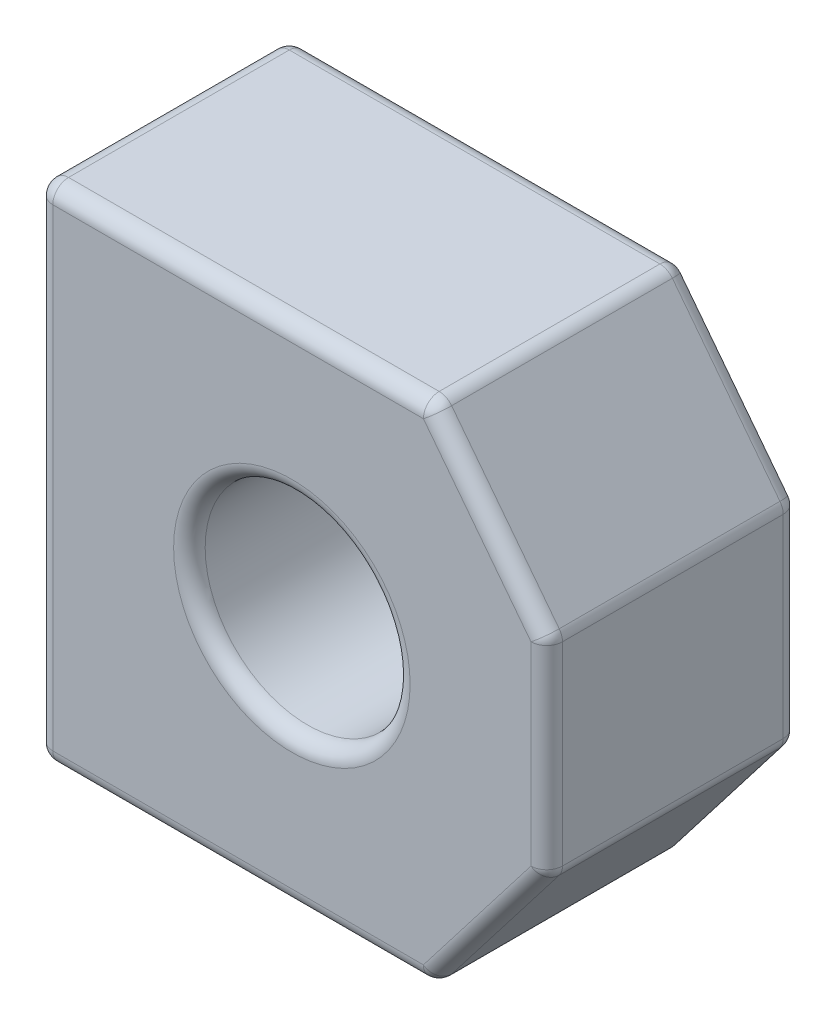
ISO-10303-21;
HEADER;
FILE_DESCRIPTION(('STEP AP214'),'2;1');
FILE_NAME('part.step','',(''),(''),'','','');
FILE_SCHEMA(('AUTOMOTIVE_DESIGN { 1 0 10303 214 1 1 1 1 }'));
ENDSEC;
DATA;
#1=APPLICATION_CONTEXT('core data for automotive mechanical design processes');
#2=APPLICATION_PROTOCOL_DEFINITION('international standard','automotive_design',2000,#1);
#3=PRODUCT_CONTEXT('',#1,'mechanical');
#4=PRODUCT('Part','Part','',(#3));
#5=PRODUCT_RELATED_PRODUCT_CATEGORY('part','',(#4));
#6=PRODUCT_DEFINITION_FORMATION('','',#4);
#7=PRODUCT_DEFINITION_CONTEXT('part definition',#1,'design');
#8=PRODUCT_DEFINITION('design','',#6,#7);
#9=PRODUCT_DEFINITION_SHAPE('','',#8);
#10=(LENGTH_UNIT() NAMED_UNIT(*) SI_UNIT(.MILLI.,.METRE.));
#11=(NAMED_UNIT(*) PLANE_ANGLE_UNIT() SI_UNIT($,.RADIAN.));
#12=(NAMED_UNIT(*) SI_UNIT($,.STERADIAN.) SOLID_ANGLE_UNIT());
#13=UNCERTAINTY_MEASURE_WITH_UNIT(LENGTH_MEASURE(1.E-05),#10,'distance_accuracy_value','');
#14=(GEOMETRIC_REPRESENTATION_CONTEXT(3) GLOBAL_UNCERTAINTY_ASSIGNED_CONTEXT((#13)) GLOBAL_UNIT_ASSIGNED_CONTEXT((#10,
#11,#12)) REPRESENTATION_CONTEXT('',''));
#15=CARTESIAN_POINT('',(0.,0.,0.));
#16=DIRECTION('',(0.,0.,1.));
#17=DIRECTION('',(1.,0.,0.));
#18=AXIS2_PLACEMENT_3D('',#15,#16,#17);
#19=CARTESIAN_POINT('',(25.,0.,16.));
#20=DIRECTION('',(0.,-1.,0.));
#21=DIRECTION('',(1.,0.,0.));
#22=AXIS2_PLACEMENT_3D('',#19,#20,#21);
#23=PLANE('',#22);
#24=DIRECTION('',(-1.,0.,0.));
#25=VECTOR('',#24,1.);
#26=CARTESIAN_POINT('',(25.,0.,15.));
#27=LINE('',#26,#25);
#28=CARTESIAN_POINT('',(1.,0.,15.));
#29=VERTEX_POINT('',#28);
#30=CARTESIAN_POINT('',(24.5085725420324,0.,15.));
#31=VERTEX_POINT('',#30);
#32=EDGE_CURVE('E55',#29,#31,#27,.F.);
#33=ORIENTED_EDGE('',*,*,#32,.T.);
#34=DIRECTION('',(0.,0.,-1.));
#35=VECTOR('',#34,1.);
#36=CARTESIAN_POINT('',(24.5085725420324,0.,16.));
#37=LINE('',#36,#35);
#38=CARTESIAN_POINT('',(24.5085725420324,0.,1.));
#39=VERTEX_POINT('',#38);
#40=EDGE_CURVE('E11',#31,#39,#37,.T.);
#41=ORIENTED_EDGE('',*,*,#40,.T.);
#42=DIRECTION('',(-1.,0.,0.));
#43=VECTOR('',#42,1.);
#44=CARTESIAN_POINT('',(25.,0.,1.));
#45=LINE('',#44,#43);
#46=CARTESIAN_POINT('',(1.,0.,1.));
#47=VERTEX_POINT('',#46);
#48=EDGE_CURVE('E308',#39,#47,#45,.T.);
#49=ORIENTED_EDGE('',*,*,#48,.T.);
#50=DIRECTION('',(0.,0.,-1.));
#51=VECTOR('',#50,1.);
#52=CARTESIAN_POINT('',(1.,0.,16.));
#53=LINE('',#52,#51);
#54=EDGE_CURVE('E66',#47,#29,#53,.F.);
#55=ORIENTED_EDGE('',*,*,#54,.T.);
#56=EDGE_LOOP('',(#33,#41,#49,#55));
#57=FACE_BOUND('',#56,.T.);
#58=ADVANCED_FACE('F45',(#57),#23,.F.);
#59=CARTESIAN_POINT('',(0.,0.,16.));
#60=DIRECTION('',(1.,0.,0.));
#61=DIRECTION('',(0.,1.,0.));
#62=AXIS2_PLACEMENT_3D('',#59,#60,#61);
#63=PLANE('',#62);
#64=DIRECTION('',(0.,-1.,0.));
#65=VECTOR('',#64,1.);
#66=CARTESIAN_POINT('',(0.,0.,1.));
#67=LINE('',#66,#65);
#68=CARTESIAN_POINT('',(0.,-1.,1.));
#69=VERTEX_POINT('',#68);
#70=CARTESIAN_POINT('',(0.,-31.,1.));
#71=VERTEX_POINT('',#70);
#72=EDGE_CURVE('E278',#69,#71,#67,.T.);
#73=ORIENTED_EDGE('',*,*,#72,.T.);
#74=DIRECTION('',(0.,0.,-1.));
#75=VECTOR('',#74,1.);
#76=CARTESIAN_POINT('',(0.,-31.,16.));
#77=LINE('',#76,#75);
#78=CARTESIAN_POINT('',(0.,-31.,15.));
#79=VERTEX_POINT('',#78);
#80=EDGE_CURVE('E281',#71,#79,#77,.F.);
#81=ORIENTED_EDGE('',*,*,#80,.T.);
#82=DIRECTION('',(0.,-1.,0.));
#83=VECTOR('',#82,1.);
#84=CARTESIAN_POINT('',(0.,0.,15.));
#85=LINE('',#84,#83);
#86=CARTESIAN_POINT('',(0.,-1.,15.));
#87=VERTEX_POINT('',#86);
#88=EDGE_CURVE('E275',#79,#87,#85,.F.);
#89=ORIENTED_EDGE('',*,*,#88,.T.);
#90=DIRECTION('',(0.,0.,-1.));
#91=VECTOR('',#90,1.);
#92=CARTESIAN_POINT('',(0.,-1.,16.));
#93=LINE('',#92,#91);
#94=EDGE_CURVE('E272',#87,#69,#93,.T.);
#95=ORIENTED_EDGE('',*,*,#94,.T.);
#96=EDGE_LOOP('',(#73,#81,#89,#95));
#97=FACE_BOUND('',#96,.T.);
#98=ADVANCED_FACE('F499',(#97),#63,.F.);
#99=CARTESIAN_POINT('',(0.,-32.,16.));
#100=DIRECTION('',(0.,1.,0.));
#101=DIRECTION('',(0.,0.,1.));
#102=AXIS2_PLACEMENT_3D('',#99,#100,#101);
#103=PLANE('',#102);
#104=DIRECTION('',(0.,0.,-1.));
#105=VECTOR('',#104,1.);
#106=CARTESIAN_POINT('',(1.,-32.,16.));
#107=LINE('',#106,#105);
#108=CARTESIAN_POINT('',(1.,-32.,15.));
#109=VERTEX_POINT('',#108);
#110=CARTESIAN_POINT('',(1.,-32.,1.));
#111=VERTEX_POINT('',#110);
#112=EDGE_CURVE('E249',#109,#111,#107,.T.);
#113=ORIENTED_EDGE('',*,*,#112,.T.);
#114=DIRECTION('',(1.,0.,0.));
#115=VECTOR('',#114,1.);
#116=CARTESIAN_POINT('',(0.,-32.,1.));
#117=LINE('',#116,#115);
#118=CARTESIAN_POINT('',(24.5085725420324,-32.,1.));
#119=VERTEX_POINT('',#118);
#120=EDGE_CURVE('E255',#111,#119,#117,.T.);
#121=ORIENTED_EDGE('',*,*,#120,.T.);
#122=DIRECTION('',(0.,0.,-1.));
#123=VECTOR('',#122,1.);
#124=CARTESIAN_POINT('',(24.5085725420324,-32.,16.));
#125=LINE('',#124,#123);
#126=CARTESIAN_POINT('',(24.5085725420324,-32.,15.));
#127=VERTEX_POINT('',#126);
#128=EDGE_CURVE('E252',#119,#127,#125,.F.);
#129=ORIENTED_EDGE('',*,*,#128,.T.);
#130=DIRECTION('',(1.,0.,0.));
#131=VECTOR('',#130,1.);
#132=CARTESIAN_POINT('',(0.,-32.,15.));
#133=LINE('',#132,#131);
#134=EDGE_CURVE('E246',#127,#109,#133,.F.);
#135=ORIENTED_EDGE('',*,*,#134,.T.);
#136=EDGE_LOOP('',(#113,#121,#129,#135));
#137=FACE_BOUND('',#136,.T.);
#138=ADVANCED_FACE('F505',(#137),#103,.F.);
#139=CARTESIAN_POINT('',(25.,-32.,16.));
#140=DIRECTION('',(-0.791666666666667,0.610953262442299,0.));
#141=DIRECTION('',(-0.610953262442299,-0.791666666666667,0.));
#142=AXIS2_PLACEMENT_3D('',#139,#140,#141);
#143=PLANE('',#142);
#144=DIRECTION('',(0.,0.,-1.));
#145=VECTOR('',#144,1.);
#146=CARTESIAN_POINT('',(25.300239208699,-31.6109532624423,16.));
#147=LINE('',#146,#145);
#148=CARTESIAN_POINT('',(25.300239208699,-31.6109532624423,15.));
#149=VERTEX_POINT('',#148);
#150=CARTESIAN_POINT('',(25.300239208699,-31.6109532624423,1.));
#151=VERTEX_POINT('',#150);
#152=EDGE_CURVE('E265',#149,#151,#147,.T.);
#153=ORIENTED_EDGE('',*,*,#152,.T.);
#154=DIRECTION('',(0.610953262442299,0.791666666666667,0.));
#155=VECTOR('',#154,1.);
#156=CARTESIAN_POINT('',(25.,-32.,1.));
#157=LINE('',#156,#155);
#158=CARTESIAN_POINT('',(32.1231058159743,-22.7699560927071,1.));
#159=VERTEX_POINT('',#158);
#160=EDGE_CURVE('E269',#151,#159,#157,.T.);
#161=ORIENTED_EDGE('',*,*,#160,.T.);
#162=DIRECTION('',(0.,0.,-1.));
#163=VECTOR('',#162,1.);
#164=CARTESIAN_POINT('',(32.1231058159743,-22.7699560927071,16.));
#165=LINE('',#164,#163);
#166=CARTESIAN_POINT('',(32.1231058159743,-22.7699560927071,15.));
#167=VERTEX_POINT('',#166);
#168=EDGE_CURVE('E262',#159,#167,#165,.F.);
#169=ORIENTED_EDGE('',*,*,#168,.T.);
#170=DIRECTION('',(0.610953262442299,0.791666666666667,0.));
#171=VECTOR('',#170,1.);
#172=CARTESIAN_POINT('',(25.,-32.,15.));
#173=LINE('',#172,#171);
#174=EDGE_CURVE('E259',#167,#149,#173,.F.);
#175=ORIENTED_EDGE('',*,*,#174,.T.);
#176=EDGE_LOOP('',(#153,#161,#169,#175));
#177=FACE_BOUND('',#176,.T.);
#178=ADVANCED_FACE('F646',(#177),#143,.F.);
#179=CARTESIAN_POINT('',(32.3314391493076,-22.5,16.));
#180=DIRECTION('',(-1.,0.,0.));
#181=DIRECTION('',(0.,0.,1.));
#182=AXIS2_PLACEMENT_3D('',#179,#180,#181);
#183=PLANE('',#182);
#184=DIRECTION('',(0.,1.,0.));
#185=VECTOR('',#184,1.);
#186=CARTESIAN_POINT('',(32.3314391493076,-22.5,1.));
#187=LINE('',#186,#185);
#188=CARTESIAN_POINT('',(32.3314391493076,-22.1590028302648,1.));
#189=VERTEX_POINT('',#188);
#190=CARTESIAN_POINT('',(32.3314391493076,-9.84099716973524,1.));
#191=VERTEX_POINT('',#190);
#192=EDGE_CURVE('E239',#189,#191,#187,.T.);
#193=ORIENTED_EDGE('',*,*,#192,.T.);
#194=DIRECTION('',(0.,0.,-1.));
#195=VECTOR('',#194,1.);
#196=CARTESIAN_POINT('',(32.3314391493076,-9.84099716973524,16.));
#197=LINE('',#196,#195);
#198=CARTESIAN_POINT('',(32.3314391493076,-9.84099716973524,15.));
#199=VERTEX_POINT('',#198);
#200=EDGE_CURVE('E242',#191,#199,#197,.F.);
#201=ORIENTED_EDGE('',*,*,#200,.T.);
#202=DIRECTION('',(0.,1.,0.));
#203=VECTOR('',#202,1.);
#204=CARTESIAN_POINT('',(32.3314391493076,-22.5,15.));
#205=LINE('',#204,#203);
#206=CARTESIAN_POINT('',(32.3314391493076,-22.1590028302648,15.));
#207=VERTEX_POINT('',#206);
#208=EDGE_CURVE('E233',#199,#207,#205,.F.);
#209=ORIENTED_EDGE('',*,*,#208,.T.);
#210=DIRECTION('',(0.,0.,-1.));
#211=VECTOR('',#210,1.);
#212=CARTESIAN_POINT('',(32.3314391493076,-22.1590028302648,16.));
#213=LINE('',#212,#211);
#214=EDGE_CURVE('E236',#207,#189,#213,.T.);
#215=ORIENTED_EDGE('',*,*,#214,.T.);
#216=EDGE_LOOP('',(#193,#201,#209,#215));
#217=FACE_BOUND('',#216,.T.);
#218=ADVANCED_FACE('F653',(#217),#183,.F.);
#219=CARTESIAN_POINT('',(32.3314391493076,-9.5,16.));
#220=DIRECTION('',(-0.791666666666667,-0.610953262442299,0.));
#221=DIRECTION('',(0.610953262442299,-0.791666666666667,0.));
#222=AXIS2_PLACEMENT_3D('',#219,#220,#221);
#223=PLANE('',#222);
#224=DIRECTION('',(0.,0.,-1.));
#225=VECTOR('',#224,1.);
#226=CARTESIAN_POINT('',(32.1231058159743,-9.23004390729294,16.));
#227=LINE('',#226,#225);
#228=CARTESIAN_POINT('',(32.1231058159743,-9.23004390729294,15.));
#229=VERTEX_POINT('',#228);
#230=CARTESIAN_POINT('',(32.1231058159743,-9.23004390729294,1.));
#231=VERTEX_POINT('',#230);
#232=EDGE_CURVE('E208',#229,#231,#227,.T.);
#233=ORIENTED_EDGE('',*,*,#232,.T.);
#234=DIRECTION('',(-0.610953262442299,0.791666666666667,0.));
#235=VECTOR('',#234,1.);
#236=CARTESIAN_POINT('',(32.3314391493076,-9.5,1.));
#237=LINE('',#236,#235);
#238=CARTESIAN_POINT('',(25.300239208699,-0.389046737557701,1.));
#239=VERTEX_POINT('',#238);
#240=EDGE_CURVE('E176',#231,#239,#237,.T.);
#241=ORIENTED_EDGE('',*,*,#240,.T.);
#242=DIRECTION('',(0.,0.,-1.));
#243=VECTOR('',#242,1.);
#244=CARTESIAN_POINT('',(25.300239208699,-0.389046737557699,16.));
#245=LINE('',#244,#243);
#246=CARTESIAN_POINT('',(25.300239208699,-0.389046737557701,15.));
#247=VERTEX_POINT('',#246);
#248=EDGE_CURVE('E196',#239,#247,#245,.F.);
#249=ORIENTED_EDGE('',*,*,#248,.T.);
#250=DIRECTION('',(-0.610953262442299,0.791666666666667,0.));
#251=VECTOR('',#250,1.);
#252=CARTESIAN_POINT('',(32.3314391493076,-9.5,15.));
#253=LINE('',#252,#251);
#254=EDGE_CURVE('E203',#247,#229,#253,.F.);
#255=ORIENTED_EDGE('',*,*,#254,.T.);
#256=EDGE_LOOP('',(#233,#241,#249,#255));
#257=FACE_BOUND('',#256,.T.);
#258=ADVANCED_FACE('F206',(#257),#223,.F.);
#259=CARTESIAN_POINT('',(0.,0.,16.));
#260=DIRECTION('',(0.,0.,1.));
#261=DIRECTION('',(1.,0.,0.));
#262=AXIS2_PLACEMENT_3D('',#259,#260,#261);
#263=PLANE('',#262);
#264=CARTESIAN_POINT('',(16.1657195746538,-16.,16.));
#265=DIRECTION('',(0.,0.,1.));
#266=DIRECTION('',(1.,0.,0.));
#267=AXIS2_PLACEMENT_3D('',#264,#265,#266);
#268=CIRCLE('',#267,7.50000000000001);
#269=CARTESIAN_POINT('',(23.6657195746538,-16.,16.));
#270=VERTEX_POINT('',#269);
#271=EDGE_CURVE('E304',#270,#270,#268,.F.);
#272=ORIENTED_EDGE('',*,*,#271,.T.);
#273=EDGE_LOOP('',(#272));
#274=FACE_BOUND('',#273,.T.);
#275=DIRECTION('',(0.,1.,0.));
#276=VECTOR('',#275,1.);
#277=CARTESIAN_POINT('',(31.3314391493076,-9.5,16.));
#278=LINE('',#277,#276);
#279=CARTESIAN_POINT('',(31.3314391493076,-22.1590028302648,16.));
#280=VERTEX_POINT('',#279);
#281=CARTESIAN_POINT('',(31.3314391493076,-9.84099716973525,16.));
#282=VERTEX_POINT('',#281);
#283=EDGE_CURVE('E297',#280,#282,#278,.T.);
#284=ORIENTED_EDGE('',*,*,#283,.T.);
#285=DIRECTION('',(-0.610953262442299,0.791666666666667,0.));
#286=VECTOR('',#285,1.);
#287=CARTESIAN_POINT('',(24.2083333333333,-0.610953262442307,16.));
#288=LINE('',#287,#286);
#289=CARTESIAN_POINT('',(24.5085725420324,-1.,16.));
#290=VERTEX_POINT('',#289);
#291=EDGE_CURVE('E300',#282,#290,#288,.T.);
#292=ORIENTED_EDGE('',*,*,#291,.T.);
#293=DIRECTION('',(-1.,0.,0.));
#294=VECTOR('',#293,1.);
#295=CARTESIAN_POINT('',(0.,-1.,16.));
#296=LINE('',#295,#294);
#297=CARTESIAN_POINT('',(1.,-1.,16.));
#298=VERTEX_POINT('',#297);
#299=EDGE_CURVE('E285',#290,#298,#296,.T.);
#300=ORIENTED_EDGE('',*,*,#299,.T.);
#301=DIRECTION('',(0.,-1.,0.));
#302=VECTOR('',#301,1.);
#303=CARTESIAN_POINT('',(1.,-32.,16.));
#304=LINE('',#303,#302);
#305=CARTESIAN_POINT('',(1.,-31.,16.));
#306=VERTEX_POINT('',#305);
#307=EDGE_CURVE('E288',#298,#306,#304,.T.);
#308=ORIENTED_EDGE('',*,*,#307,.T.);
#309=DIRECTION('',(1.,0.,0.));
#310=VECTOR('',#309,1.);
#311=CARTESIAN_POINT('',(25.,-31.,16.));
#312=LINE('',#311,#310);
#313=CARTESIAN_POINT('',(24.5085725420324,-31.,16.));
#314=VERTEX_POINT('',#313);
#315=EDGE_CURVE('E291',#306,#314,#312,.T.);
#316=ORIENTED_EDGE('',*,*,#315,.T.);
#317=DIRECTION('',(0.610953262442299,0.791666666666667,0.));
#318=VECTOR('',#317,1.);
#319=CARTESIAN_POINT('',(31.5397724826409,-21.8890467375577,16.));
#320=LINE('',#319,#318);
#321=EDGE_CURVE('E294',#314,#280,#320,.T.);
#322=ORIENTED_EDGE('',*,*,#321,.T.);
#323=EDGE_LOOP('',(#284,#292,#300,#308,#316,#322));
#324=FACE_BOUND('',#323,.T.);
#325=ADVANCED_FACE('F623',(#274,#324),#263,.T.);
#326=CARTESIAN_POINT('',(0.,0.,0.));
#327=DIRECTION('',(0.,0.,1.));
#328=DIRECTION('',(1.,0.,0.));
#329=AXIS2_PLACEMENT_3D('',#326,#327,#328);
#330=PLANE('',#329);
#331=DIRECTION('',(-0.610953262442299,0.791666666666667,0.));
#332=VECTOR('',#331,1.);
#333=CARTESIAN_POINT('',(14.8767361111111,11.4808300567282,0.));
#334=LINE('',#333,#332);
#335=CARTESIAN_POINT('',(24.5085725420324,-1.,0.));
#336=VERTEX_POINT('',#335);
#337=CARTESIAN_POINT('',(31.3314391493076,-9.84099716973524,0.));
#338=VERTEX_POINT('',#337);
#339=EDGE_CURVE('E178',#336,#338,#334,.F.);
#340=ORIENTED_EDGE('',*,*,#339,.T.);
#341=DIRECTION('',(0.,1.,0.));
#342=VECTOR('',#341,1.);
#343=CARTESIAN_POINT('',(31.3314391493076,0.,0.));
#344=LINE('',#343,#342);
#345=CARTESIAN_POINT('',(31.3314391493076,-22.1590028302648,0.));
#346=VERTEX_POINT('',#345);
#347=EDGE_CURVE('E230',#338,#346,#344,.F.);
#348=ORIENTED_EDGE('',*,*,#347,.T.);
#349=DIRECTION('',(0.610953262442299,0.791666666666667,0.));
#350=VECTOR('',#349,1.);
#351=CARTESIAN_POINT('',(30.3542187596494,-23.4252745011726,0.));
#352=LINE('',#351,#350);
#353=CARTESIAN_POINT('',(24.5085725420324,-31.,0.));
#354=VERTEX_POINT('',#353);
#355=EDGE_CURVE('E227',#346,#354,#352,.F.);
#356=ORIENTED_EDGE('',*,*,#355,.T.);
#357=DIRECTION('',(1.,0.,0.));
#358=VECTOR('',#357,1.);
#359=CARTESIAN_POINT('',(0.,-31.,0.));
#360=LINE('',#359,#358);
#361=CARTESIAN_POINT('',(1.,-31.,0.));
#362=VERTEX_POINT('',#361);
#363=EDGE_CURVE('E222',#354,#362,#360,.F.);
#364=ORIENTED_EDGE('',*,*,#363,.T.);
#365=DIRECTION('',(0.,-1.,0.));
#366=VECTOR('',#365,1.);
#367=CARTESIAN_POINT('',(1.,0.,0.));
#368=LINE('',#367,#366);
#369=CARTESIAN_POINT('',(1.,-1.,0.));
#370=VERTEX_POINT('',#369);
#371=EDGE_CURVE('E215',#362,#370,#368,.F.);
#372=ORIENTED_EDGE('',*,*,#371,.T.);
#373=DIRECTION('',(-1.,0.,0.));
#374=VECTOR('',#373,1.);
#375=CARTESIAN_POINT('',(0.,-1.,0.));
#376=LINE('',#375,#374);
#377=EDGE_CURVE('E211',#370,#336,#376,.F.);
#378=ORIENTED_EDGE('',*,*,#377,.T.);
#379=EDGE_LOOP('',(#340,#348,#356,#364,#372,#378));
#380=FACE_BOUND('',#379,.T.);
#381=CARTESIAN_POINT('',(16.1657195746538,-16.,0.));
#382=DIRECTION('',(0.,0.,1.));
#383=DIRECTION('',(1.,0.,0.));
#384=AXIS2_PLACEMENT_3D('',#381,#382,#383);
#385=CIRCLE('',#384,3.45);
#386=CARTESIAN_POINT('',(19.6157195746538,-16.,0.));
#387=VERTEX_POINT('',#386);
#388=EDGE_CURVE('E447',#387,#387,#385,.T.);
#389=ORIENTED_EDGE('',*,*,#388,.T.);
#390=EDGE_LOOP('',(#389));
#391=FACE_BOUND('',#390,.T.);
#392=ADVANCED_FACE('F490',(#380,#391),#330,.F.);
#393=CARTESIAN_POINT('',(16.1657195746538,-16.,5.));
#394=DIRECTION('',(0.,0.,1.));
#395=DIRECTION('',(1.,0.,0.));
#396=AXIS2_PLACEMENT_3D('',#393,#394,#395);
#397=CYLINDRICAL_SURFACE('',#396,6.50000000000001);
#398=CARTESIAN_POINT('',(16.1657195746538,-16.,6.));
#399=DIRECTION('',(0.,0.,1.));
#400=DIRECTION('',(1.,0.,0.));
#401=AXIS2_PLACEMENT_3D('',#398,#399,#400);
#402=CIRCLE('',#401,6.50000000000001);
#403=CARTESIAN_POINT('',(22.6657195746538,-16.,6.));
#404=VERTEX_POINT('',#403);
#405=EDGE_CURVE('E204',#404,#404,#402,.F.);
#406=ORIENTED_EDGE('',*,*,#405,.T.);
#407=EDGE_LOOP('',(#406));
#408=FACE_BOUND('',#407,.T.);
#409=CARTESIAN_POINT('',(16.1657195746538,-16.,15.));
#410=DIRECTION('',(0.,0.,1.));
#411=DIRECTION('',(1.,0.,0.));
#412=AXIS2_PLACEMENT_3D('',#409,#410,#411);
#413=CIRCLE('',#412,6.50000000000001);
#414=CARTESIAN_POINT('',(22.6657195746538,-16.,15.));
#415=VERTEX_POINT('',#414);
#416=EDGE_CURVE('E459',#415,#415,#413,.T.);
#417=ORIENTED_EDGE('',*,*,#416,.T.);
#418=EDGE_LOOP('',(#417));
#419=FACE_BOUND('',#418,.T.);
#420=ADVANCED_FACE('F702',(#408,#419),#397,.F.);
#421=CARTESIAN_POINT('',(16.1657195746538,-16.,5.));
#422=DIRECTION('',(0.,0.,1.));
#423=DIRECTION('',(1.,0.,0.));
#424=AXIS2_PLACEMENT_3D('',#421,#422,#423);
#425=PLANE('',#424);
#426=CARTESIAN_POINT('',(16.1657195746538,-16.,5.));
#427=DIRECTION('',(0.,0.,1.));
#428=DIRECTION('',(1.,0.,0.));
#429=AXIS2_PLACEMENT_3D('',#426,#427,#428);
#430=CIRCLE('',#429,5.50000000000001);
#431=CARTESIAN_POINT('',(21.6657195746538,-16.,5.));
#432=VERTEX_POINT('',#431);
#433=EDGE_CURVE('E453',#432,#432,#430,.T.);
#434=ORIENTED_EDGE('',*,*,#433,.T.);
#435=EDGE_LOOP('',(#434));
#436=FACE_BOUND('',#435,.T.);
#437=CARTESIAN_POINT('',(16.1657195746538,-16.,5.));
#438=DIRECTION('',(0.,0.,1.));
#439=DIRECTION('',(1.,0.,0.));
#440=AXIS2_PLACEMENT_3D('',#437,#438,#439);
#441=CIRCLE('',#440,3.45);
#442=CARTESIAN_POINT('',(19.6157195746538,-16.,5.));
#443=VERTEX_POINT('',#442);
#444=EDGE_CURVE('E440',#443,#443,#441,.T.);
#445=ORIENTED_EDGE('',*,*,#444,.F.);
#446=EDGE_LOOP('',(#445));
#447=FACE_BOUND('',#446,.T.);
#448=ADVANCED_FACE('F710',(#436,#447),#425,.T.);
#449=CARTESIAN_POINT('',(16.1657195746538,-16.,-5.99999999999999));
#450=DIRECTION('',(0.,0.,1.));
#451=DIRECTION('',(1.,0.,0.));
#452=AXIS2_PLACEMENT_3D('',#449,#450,#451);
#453=CYLINDRICAL_SURFACE('',#452,3.45);
#454=ORIENTED_EDGE('',*,*,#444,.T.);
#455=EDGE_LOOP('',(#454));
#456=FACE_BOUND('',#455,.T.);
#457=ORIENTED_EDGE('',*,*,#388,.F.);
#458=EDGE_LOOP('',(#457));
#459=FACE_BOUND('',#458,.T.);
#460=ADVANCED_FACE('F514',(#456,#459),#453,.F.);
#461=CARTESIAN_POINT('',(16.1657195746538,-16.,6.));
#462=DIRECTION('',(0.,0.,1.));
#463=DIRECTION('',(1.,0.,0.));
#464=AXIS2_PLACEMENT_3D('',#461,#462,#463);
#465=TOROIDAL_SURFACE('',#464,5.50000000000001,1.);
#466=ORIENTED_EDGE('',*,*,#405,.F.);
#467=EDGE_LOOP('',(#466));
#468=FACE_BOUND('',#467,.T.);
#469=ORIENTED_EDGE('',*,*,#433,.F.);
#470=EDGE_LOOP('',(#469));
#471=FACE_BOUND('',#470,.T.);
#472=ADVANCED_FACE('F510',(#468,#471),#465,.F.);
#473=CARTESIAN_POINT('',(0.,-31.,15.));
#474=DIRECTION('',(-1.,0.,0.));
#475=DIRECTION('',(0.,0.,1.));
#476=AXIS2_PLACEMENT_3D('',#473,#474,#475);
#477=CYLINDRICAL_SURFACE('',#476,1.);
#478=CARTESIAN_POINT('',(24.5085725420324,-31.,15.));
#479=DIRECTION('',(1.,0.,0.));
#480=DIRECTION('',(0.,1.,0.));
#481=AXIS2_PLACEMENT_3D('',#478,#479,#480);
#482=CIRCLE('',#481,1.);
#483=EDGE_CURVE('E49',#314,#127,#482,.T.);
#484=ORIENTED_EDGE('',*,*,#483,.F.);
#485=ORIENTED_EDGE('',*,*,#315,.F.);
#486=CARTESIAN_POINT('',(1.,-31.,15.));
#487=DIRECTION('',(-1.,0.,0.));
#488=DIRECTION('',(0.,0.,1.));
#489=AXIS2_PLACEMENT_3D('',#486,#487,#488);
#490=CIRCLE('',#489,1.);
#491=EDGE_CURVE('E431',#109,#306,#490,.T.);
#492=ORIENTED_EDGE('',*,*,#491,.F.);
#493=ORIENTED_EDGE('',*,*,#134,.F.);
#494=EDGE_LOOP('',(#484,#485,#492,#493));
#495=FACE_BOUND('',#494,.T.);
#496=ADVANCED_FACE('F513',(#495),#477,.T.);
#497=CARTESIAN_POINT('',(24.5085725420324,-31.,15.));
#498=DIRECTION('',(0.,0.,1.));
#499=DIRECTION('',(1.,0.,0.));
#500=AXIS2_PLACEMENT_3D('',#497,#498,#499);
#501=SPHERICAL_SURFACE('',#500,1.);
#502=CARTESIAN_POINT('',(24.5085725420324,-31.,15.));
#503=DIRECTION('',(-0.610953262442299,-0.791666666666667,0.));
#504=DIRECTION('',(0.791666666666667,-0.610953262442299,0.));
#505=AXIS2_PLACEMENT_3D('',#502,#503,#504);
#506=CIRCLE('',#505,1.);
#507=EDGE_CURVE('E424',#314,#149,#506,.F.);
#508=ORIENTED_EDGE('',*,*,#507,.F.);
#509=ORIENTED_EDGE('',*,*,#483,.T.);
#510=CARTESIAN_POINT('',(24.5085725420324,-31.,15.));
#511=DIRECTION('',(0.,0.,1.));
#512=DIRECTION('',(1.,0.,0.));
#513=AXIS2_PLACEMENT_3D('',#510,#511,#512);
#514=CIRCLE('',#513,1.);
#515=EDGE_CURVE('E428',#149,#127,#514,.F.);
#516=ORIENTED_EDGE('',*,*,#515,.F.);
#517=EDGE_LOOP('',(#508,#509,#516));
#518=FACE_BOUND('',#517,.T.);
#519=ADVANCED_FACE('F609',(#518),#501,.T.);
#520=CARTESIAN_POINT('',(1.,-31.,15.));
#521=DIRECTION('',(0.,0.,1.));
#522=DIRECTION('',(1.,0.,0.));
#523=AXIS2_PLACEMENT_3D('',#520,#521,#522);
#524=SPHERICAL_SURFACE('',#523,1.);
#525=CARTESIAN_POINT('',(1.,-31.,15.));
#526=DIRECTION('',(0.,0.,1.));
#527=DIRECTION('',(1.,0.,0.));
#528=AXIS2_PLACEMENT_3D('',#525,#526,#527);
#529=CIRCLE('',#528,1.);
#530=EDGE_CURVE('E416',#109,#79,#529,.F.);
#531=ORIENTED_EDGE('',*,*,#530,.F.);
#532=ORIENTED_EDGE('',*,*,#491,.T.);
#533=CARTESIAN_POINT('',(1.,-31.,15.));
#534=DIRECTION('',(0.,-1.,0.));
#535=DIRECTION('',(0.,0.,-1.));
#536=AXIS2_PLACEMENT_3D('',#533,#534,#535);
#537=CIRCLE('',#536,1.);
#538=EDGE_CURVE('E420',#79,#306,#537,.F.);
#539=ORIENTED_EDGE('',*,*,#538,.F.);
#540=EDGE_LOOP('',(#531,#532,#539));
#541=FACE_BOUND('',#540,.T.);
#542=ADVANCED_FACE('F605',(#541),#524,.T.);
#543=CARTESIAN_POINT('',(24.5085725420324,-31.,16.));
#544=DIRECTION('',(0.,0.,-1.));
#545=DIRECTION('',(-1.,0.,0.));
#546=AXIS2_PLACEMENT_3D('',#543,#544,#545);
#547=CYLINDRICAL_SURFACE('',#546,1.);
#548=ORIENTED_EDGE('',*,*,#515,.T.);
#549=ORIENTED_EDGE('',*,*,#128,.F.);
#550=CARTESIAN_POINT('',(24.5085725420324,-31.,1.));
#551=DIRECTION('',(0.,0.,-1.));
#552=DIRECTION('',(-1.,0.,0.));
#553=AXIS2_PLACEMENT_3D('',#550,#551,#552);
#554=CIRCLE('',#553,1.);
#555=EDGE_CURVE('E409',#151,#119,#554,.T.);
#556=ORIENTED_EDGE('',*,*,#555,.F.);
#557=ORIENTED_EDGE('',*,*,#152,.F.);
#558=EDGE_LOOP('',(#548,#549,#556,#557));
#559=FACE_BOUND('',#558,.T.);
#560=ADVANCED_FACE('F601',(#559),#547,.T.);
#561=CARTESIAN_POINT('',(30.3542187596494,-23.4252745011726,15.));
#562=DIRECTION('',(-0.610953262442299,-0.791666666666667,0.));
#563=DIRECTION('',(0.791666666666667,-0.610953262442299,0.));
#564=AXIS2_PLACEMENT_3D('',#561,#562,#563);
#565=CYLINDRICAL_SURFACE('',#564,1.);
#566=ORIENTED_EDGE('',*,*,#507,.T.);
#567=ORIENTED_EDGE('',*,*,#174,.F.);
#568=CARTESIAN_POINT('',(31.3314391493076,-22.1590028302648,15.));
#569=DIRECTION('',(0.610953262442293,0.791666666666672,0.));
#570=DIRECTION('',(-0.791666666666672,0.610953262442293,0.));
#571=AXIS2_PLACEMENT_3D('',#568,#569,#570);
#572=CIRCLE('',#571,1.);
#573=EDGE_CURVE('E405',#280,#167,#572,.T.);
#574=ORIENTED_EDGE('',*,*,#573,.F.);
#575=ORIENTED_EDGE('',*,*,#321,.F.);
#576=EDGE_LOOP('',(#566,#567,#574,#575));
#577=FACE_BOUND('',#576,.T.);
#578=ADVANCED_FACE('F597',(#577),#565,.T.);
#579=CARTESIAN_POINT('',(1.,0.,15.));
#580=DIRECTION('',(0.,1.,0.));
#581=DIRECTION('',(-1.,0.,0.));
#582=AXIS2_PLACEMENT_3D('',#579,#580,#581);
#583=CYLINDRICAL_SURFACE('',#582,1.);
#584=ORIENTED_EDGE('',*,*,#538,.T.);
#585=ORIENTED_EDGE('',*,*,#307,.F.);
#586=CARTESIAN_POINT('',(1.,-1.,15.));
#587=DIRECTION('',(0.,1.,0.));
#588=DIRECTION('',(-1.,0.,0.));
#589=AXIS2_PLACEMENT_3D('',#586,#587,#588);
#590=CIRCLE('',#589,1.);
#591=EDGE_CURVE('E401',#87,#298,#590,.T.);
#592=ORIENTED_EDGE('',*,*,#591,.F.);
#593=ORIENTED_EDGE('',*,*,#88,.F.);
#594=EDGE_LOOP('',(#584,#585,#592,#593));
#595=FACE_BOUND('',#594,.T.);
#596=ADVANCED_FACE('F593',(#595),#583,.T.);
#597=CARTESIAN_POINT('',(1.,-31.,16.));
#598=DIRECTION('',(0.,0.,-1.));
#599=DIRECTION('',(-1.,0.,0.));
#600=AXIS2_PLACEMENT_3D('',#597,#598,#599);
#601=CYLINDRICAL_SURFACE('',#600,1.);
#602=ORIENTED_EDGE('',*,*,#530,.T.);
#603=ORIENTED_EDGE('',*,*,#80,.F.);
#604=CARTESIAN_POINT('',(1.,-31.,1.));
#605=DIRECTION('',(0.,0.,-1.));
#606=DIRECTION('',(-1.,0.,0.));
#607=AXIS2_PLACEMENT_3D('',#604,#605,#606);
#608=CIRCLE('',#607,1.);
#609=EDGE_CURVE('E397',#111,#71,#608,.T.);
#610=ORIENTED_EDGE('',*,*,#609,.F.);
#611=ORIENTED_EDGE('',*,*,#112,.F.);
#612=EDGE_LOOP('',(#602,#603,#610,#611));
#613=FACE_BOUND('',#612,.T.);
#614=ADVANCED_FACE('F589',(#613),#601,.T.);
#615=CARTESIAN_POINT('',(0.,-31.,1.));
#616=DIRECTION('',(1.,0.,0.));
#617=DIRECTION('',(0.,0.,-1.));
#618=AXIS2_PLACEMENT_3D('',#615,#616,#617);
#619=CYLINDRICAL_SURFACE('',#618,1.);
#620=CARTESIAN_POINT('',(24.5085725420324,-31.,1.));
#621=DIRECTION('',(1.,0.,0.));
#622=DIRECTION('',(0.,0.,-1.));
#623=AXIS2_PLACEMENT_3D('',#620,#621,#622);
#624=CIRCLE('',#623,1.);
#625=EDGE_CURVE('E412',#119,#354,#624,.T.);
#626=ORIENTED_EDGE('',*,*,#625,.F.);
#627=ORIENTED_EDGE('',*,*,#120,.F.);
#628=CARTESIAN_POINT('',(1.,-31.,1.));
#629=DIRECTION('',(-1.,0.,0.));
#630=DIRECTION('',(0.,0.,1.));
#631=AXIS2_PLACEMENT_3D('',#628,#629,#630);
#632=CIRCLE('',#631,1.);
#633=EDGE_CURVE('E393',#362,#111,#632,.T.);
#634=ORIENTED_EDGE('',*,*,#633,.F.);
#635=ORIENTED_EDGE('',*,*,#363,.F.);
#636=EDGE_LOOP('',(#626,#627,#634,#635));
#637=FACE_BOUND('',#636,.T.);
#638=ADVANCED_FACE('F585',(#637),#619,.T.);
#639=CARTESIAN_POINT('',(24.5085725420324,-31.,1.));
#640=DIRECTION('',(0.,0.,-1.));
#641=DIRECTION('',(-1.,0.,0.));
#642=AXIS2_PLACEMENT_3D('',#639,#640,#641);
#643=SPHERICAL_SURFACE('',#642,1.);
#644=ORIENTED_EDGE('',*,*,#555,.T.);
#645=ORIENTED_EDGE('',*,*,#625,.T.);
#646=CARTESIAN_POINT('',(24.5085725420324,-31.,1.));
#647=DIRECTION('',(-0.610953262442301,-0.791666666666665,0.));
#648=DIRECTION('',(0.791666666666665,-0.610953262442301,0.));
#649=AXIS2_PLACEMENT_3D('',#646,#647,#648);
#650=CIRCLE('',#649,1.);
#651=EDGE_CURVE('E389',#151,#354,#650,.F.);
#652=ORIENTED_EDGE('',*,*,#651,.F.);
#653=EDGE_LOOP('',(#644,#645,#652));
#654=FACE_BOUND('',#653,.T.);
#655=ADVANCED_FACE('F581',(#654),#643,.T.);
#656=CARTESIAN_POINT('',(31.3314391493076,-22.1590028302648,15.));
#657=DIRECTION('',(0.,0.,1.));
#658=DIRECTION('',(0.,-1.,0.));
#659=AXIS2_PLACEMENT_3D('',#656,#657,#658);
#660=SPHERICAL_SURFACE('',#659,1.);
#661=CARTESIAN_POINT('',(31.3314391493076,-22.1590028302648,15.));
#662=DIRECTION('',(0.,-1.,0.));
#663=DIRECTION('',(0.,0.,-1.));
#664=AXIS2_PLACEMENT_3D('',#661,#662,#663);
#665=CIRCLE('',#664,1.);
#666=EDGE_CURVE('E381',#280,#207,#665,.F.);
#667=ORIENTED_EDGE('',*,*,#666,.F.);
#668=ORIENTED_EDGE('',*,*,#573,.T.);
#669=CARTESIAN_POINT('',(31.3314391493076,-22.1590028302648,15.));
#670=DIRECTION('',(0.,0.,1.));
#671=DIRECTION('',(1.,0.,0.));
#672=AXIS2_PLACEMENT_3D('',#669,#670,#671);
#673=CIRCLE('',#672,1.);
#674=EDGE_CURVE('E385',#207,#167,#673,.F.);
#675=ORIENTED_EDGE('',*,*,#674,.F.);
#676=EDGE_LOOP('',(#667,#668,#675));
#677=FACE_BOUND('',#676,.T.);
#678=ADVANCED_FACE('F577',(#677),#660,.T.);
#679=CARTESIAN_POINT('',(1.,-1.,15.));
#680=DIRECTION('',(0.,0.,1.));
#681=DIRECTION('',(1.,0.,0.));
#682=AXIS2_PLACEMENT_3D('',#679,#680,#681);
#683=SPHERICAL_SURFACE('',#682,1.);
#684=CARTESIAN_POINT('',(1.,-1.,15.));
#685=DIRECTION('',(0.,0.,1.));
#686=DIRECTION('',(1.,0.,0.));
#687=AXIS2_PLACEMENT_3D('',#684,#685,#686);
#688=CIRCLE('',#687,1.);
#689=EDGE_CURVE('E374',#87,#29,#688,.F.);
#690=ORIENTED_EDGE('',*,*,#689,.F.);
#691=ORIENTED_EDGE('',*,*,#591,.T.);
#692=CARTESIAN_POINT('',(1.,-1.,15.));
#693=DIRECTION('',(-1.,0.,0.));
#694=DIRECTION('',(0.,-1.,0.));
#695=AXIS2_PLACEMENT_3D('',#692,#693,#694);
#696=CIRCLE('',#695,1.);
#697=EDGE_CURVE('E377',#29,#298,#696,.F.);
#698=ORIENTED_EDGE('',*,*,#697,.F.);
#699=EDGE_LOOP('',(#690,#691,#698));
#700=FACE_BOUND('',#699,.T.);
#701=ADVANCED_FACE('F573',(#700),#683,.T.);
#702=CARTESIAN_POINT('',(1.,-31.,1.));
#703=DIRECTION('',(0.,-1.,0.));
#704=DIRECTION('',(0.,0.,-1.));
#705=AXIS2_PLACEMENT_3D('',#702,#703,#704);
#706=SPHERICAL_SURFACE('',#705,1.);
#707=ORIENTED_EDGE('',*,*,#633,.T.);
#708=ORIENTED_EDGE('',*,*,#609,.T.);
#709=CARTESIAN_POINT('',(1.,-31.,1.));
#710=DIRECTION('',(0.,-1.,0.));
#711=DIRECTION('',(0.,0.,-1.));
#712=AXIS2_PLACEMENT_3D('',#709,#710,#711);
#713=CIRCLE('',#712,1.);
#714=EDGE_CURVE('E370',#362,#71,#713,.F.);
#715=ORIENTED_EDGE('',*,*,#714,.F.);
#716=EDGE_LOOP('',(#707,#708,#715));
#717=FACE_BOUND('',#716,.T.);
#718=ADVANCED_FACE('F569',(#717),#706,.T.);
#719=CARTESIAN_POINT('',(24.2083333333333,-31.3890467375577,1.));
#720=DIRECTION('',(0.610953262442299,0.791666666666667,0.));
#721=DIRECTION('',(-0.791666666666667,0.610953262442299,0.));
#722=AXIS2_PLACEMENT_3D('',#719,#720,#721);
#723=CYLINDRICAL_SURFACE('',#722,1.);
#724=ORIENTED_EDGE('',*,*,#651,.T.);
#725=ORIENTED_EDGE('',*,*,#355,.F.);
#726=CARTESIAN_POINT('',(31.3314391493076,-22.1590028302648,1.));
#727=DIRECTION('',(0.610953262442297,0.791666666666668,0.));
#728=DIRECTION('',(-0.791666666666668,0.610953262442297,0.));
#729=AXIS2_PLACEMENT_3D('',#726,#727,#728);
#730=CIRCLE('',#729,1.);
#731=EDGE_CURVE('E366',#159,#346,#730,.T.);
#732=ORIENTED_EDGE('',*,*,#731,.F.);
#733=ORIENTED_EDGE('',*,*,#160,.F.);
#734=EDGE_LOOP('',(#724,#725,#732,#733));
#735=FACE_BOUND('',#734,.T.);
#736=ADVANCED_FACE('F565',(#735),#723,.T.);
#737=CARTESIAN_POINT('',(31.3314391493076,-22.1590028302648,16.));
#738=DIRECTION('',(0.,0.,-1.));
#739=DIRECTION('',(-1.,0.,0.));
#740=AXIS2_PLACEMENT_3D('',#737,#738,#739);
#741=CYLINDRICAL_SURFACE('',#740,1.);
#742=ORIENTED_EDGE('',*,*,#674,.T.);
#743=ORIENTED_EDGE('',*,*,#168,.F.);
#744=CARTESIAN_POINT('',(31.3314391493076,-22.1590028302648,1.));
#745=DIRECTION('',(0.,0.,-1.));
#746=DIRECTION('',(-1.,0.,0.));
#747=AXIS2_PLACEMENT_3D('',#744,#745,#746);
#748=CIRCLE('',#747,1.);
#749=EDGE_CURVE('E362',#189,#159,#748,.T.);
#750=ORIENTED_EDGE('',*,*,#749,.F.);
#751=ORIENTED_EDGE('',*,*,#214,.F.);
#752=EDGE_LOOP('',(#742,#743,#750,#751));
#753=FACE_BOUND('',#752,.T.);
#754=ADVANCED_FACE('F561',(#753),#741,.T.);
#755=CARTESIAN_POINT('',(31.3314391493076,0.,15.));
#756=DIRECTION('',(0.,-1.,0.));
#757=DIRECTION('',(0.,0.,-1.));
#758=AXIS2_PLACEMENT_3D('',#755,#756,#757);
#759=CYLINDRICAL_SURFACE('',#758,1.);
#760=ORIENTED_EDGE('',*,*,#666,.T.);
#761=ORIENTED_EDGE('',*,*,#208,.F.);
#762=CARTESIAN_POINT('',(31.3314391493076,-9.84099716973525,15.));
#763=DIRECTION('',(0.,1.,0.));
#764=DIRECTION('',(-1.,0.,0.));
#765=AXIS2_PLACEMENT_3D('',#762,#763,#764);
#766=CIRCLE('',#765,1.);
#767=EDGE_CURVE('E358',#282,#199,#766,.T.);
#768=ORIENTED_EDGE('',*,*,#767,.F.);
#769=ORIENTED_EDGE('',*,*,#283,.F.);
#770=EDGE_LOOP('',(#760,#761,#768,#769));
#771=FACE_BOUND('',#770,.T.);
#772=ADVANCED_FACE('F558',(#771),#759,.T.);
#773=CARTESIAN_POINT('',(14.8767361111111,11.4808300567282,15.));
#774=DIRECTION('',(0.610953262442299,-0.791666666666667,0.));
#775=DIRECTION('',(0.791666666666667,0.610953262442299,0.));
#776=AXIS2_PLACEMENT_3D('',#773,#774,#775);
#777=CYLINDRICAL_SURFACE('',#776,1.);
#778=CARTESIAN_POINT('',(24.5085725420324,-1.,15.));
#779=DIRECTION('',(-0.610953262442299,0.791666666666667,0.));
#780=DIRECTION('',(-0.791666666666667,-0.610953262442299,0.));
#781=AXIS2_PLACEMENT_3D('',#778,#779,#780);
#782=CIRCLE('',#781,1.);
#783=EDGE_CURVE('E350',#290,#247,#782,.T.);
#784=ORIENTED_EDGE('',*,*,#783,.F.);
#785=ORIENTED_EDGE('',*,*,#291,.F.);
#786=CARTESIAN_POINT('',(31.3314391493076,-9.84099716973524,15.));
#787=DIRECTION('',(0.610953262442298,-0.791666666666668,0.));
#788=DIRECTION('',(0.791666666666668,0.610953262442298,0.));
#789=AXIS2_PLACEMENT_3D('',#786,#787,#788);
#790=CIRCLE('',#789,1.);
#791=EDGE_CURVE('E354',#229,#282,#790,.T.);
#792=ORIENTED_EDGE('',*,*,#791,.F.);
#793=ORIENTED_EDGE('',*,*,#254,.F.);
#794=EDGE_LOOP('',(#784,#785,#792,#793));
#795=FACE_BOUND('',#794,.T.);
#796=ADVANCED_FACE('F471',(#795),#777,.T.);
#797=CARTESIAN_POINT('',(0.,-1.,15.));
#798=DIRECTION('',(1.,0.,0.));
#799=DIRECTION('',(0.,1.,0.));
#800=AXIS2_PLACEMENT_3D('',#797,#798,#799);
#801=CYLINDRICAL_SURFACE('',#800,1.);
#802=ORIENTED_EDGE('',*,*,#697,.T.);
#803=ORIENTED_EDGE('',*,*,#299,.F.);
#804=CARTESIAN_POINT('',(24.5085725420324,-1.,15.));
#805=DIRECTION('',(1.,0.,0.));
#806=DIRECTION('',(0.,0.,-1.));
#807=AXIS2_PLACEMENT_3D('',#804,#805,#806);
#808=CIRCLE('',#807,1.);
#809=EDGE_CURVE('E347',#31,#290,#808,.T.);
#810=ORIENTED_EDGE('',*,*,#809,.F.);
#811=ORIENTED_EDGE('',*,*,#32,.F.);
#812=EDGE_LOOP('',(#802,#803,#810,#811));
#813=FACE_BOUND('',#812,.T.);
#814=ADVANCED_FACE('F551',(#813),#801,.T.);
#815=CARTESIAN_POINT('',(1.,-1.,16.));
#816=DIRECTION('',(0.,0.,-1.));
#817=DIRECTION('',(-1.,0.,0.));
#818=AXIS2_PLACEMENT_3D('',#815,#816,#817);
#819=CYLINDRICAL_SURFACE('',#818,1.);
#820=ORIENTED_EDGE('',*,*,#689,.T.);
#821=ORIENTED_EDGE('',*,*,#54,.F.);
#822=CARTESIAN_POINT('',(1.,-1.,1.));
#823=DIRECTION('',(0.,0.,-1.));
#824=DIRECTION('',(-1.,0.,0.));
#825=AXIS2_PLACEMENT_3D('',#822,#823,#824);
#826=CIRCLE('',#825,1.);
#827=EDGE_CURVE('E343',#69,#47,#826,.T.);
#828=ORIENTED_EDGE('',*,*,#827,.F.);
#829=ORIENTED_EDGE('',*,*,#94,.F.);
#830=EDGE_LOOP('',(#820,#821,#828,#829));
#831=FACE_BOUND('',#830,.T.);
#832=ADVANCED_FACE('F547',(#831),#819,.T.);
#833=CARTESIAN_POINT('',(1.,0.,1.));
#834=DIRECTION('',(0.,-1.,0.));
#835=DIRECTION('',(1.,0.,0.));
#836=AXIS2_PLACEMENT_3D('',#833,#834,#835);
#837=CYLINDRICAL_SURFACE('',#836,1.);
#838=ORIENTED_EDGE('',*,*,#714,.T.);
#839=ORIENTED_EDGE('',*,*,#72,.F.);
#840=CARTESIAN_POINT('',(1.,-1.,1.));
#841=DIRECTION('',(0.,1.,0.));
#842=DIRECTION('',(-1.,0.,0.));
#843=AXIS2_PLACEMENT_3D('',#840,#841,#842);
#844=CIRCLE('',#843,1.);
#845=EDGE_CURVE('E339',#370,#69,#844,.T.);
#846=ORIENTED_EDGE('',*,*,#845,.F.);
#847=ORIENTED_EDGE('',*,*,#371,.F.);
#848=EDGE_LOOP('',(#838,#839,#846,#847));
#849=FACE_BOUND('',#848,.T.);
#850=ADVANCED_FACE('F543',(#849),#837,.T.);
#851=CARTESIAN_POINT('',(31.3314391493076,-22.1590028302648,1.));
#852=DIRECTION('',(0.,0.,-1.));
#853=DIRECTION('',(0.,1.,0.));
#854=AXIS2_PLACEMENT_3D('',#851,#852,#853);
#855=SPHERICAL_SURFACE('',#854,1.);
#856=ORIENTED_EDGE('',*,*,#749,.T.);
#857=ORIENTED_EDGE('',*,*,#731,.T.);
#858=CARTESIAN_POINT('',(31.3314391493076,-22.1590028302648,1.));
#859=DIRECTION('',(0.,-1.,0.));
#860=DIRECTION('',(1.,0.,0.));
#861=AXIS2_PLACEMENT_3D('',#858,#859,#860);
#862=CIRCLE('',#861,1.);
#863=EDGE_CURVE('E335',#189,#346,#862,.F.);
#864=ORIENTED_EDGE('',*,*,#863,.F.);
#865=EDGE_LOOP('',(#856,#857,#864));
#866=FACE_BOUND('',#865,.T.);
#867=ADVANCED_FACE('F540',(#866),#855,.T.);
#868=CARTESIAN_POINT('',(31.3314391493076,-9.84099716973524,15.));
#869=DIRECTION('',(0.,0.,1.));
#870=DIRECTION('',(0.,-1.,0.));
#871=AXIS2_PLACEMENT_3D('',#868,#869,#870);
#872=SPHERICAL_SURFACE('',#871,1.);
#873=ORIENTED_EDGE('',*,*,#791,.T.);
#874=ORIENTED_EDGE('',*,*,#767,.T.);
#875=CARTESIAN_POINT('',(31.3314391493076,-9.84099716973524,15.));
#876=DIRECTION('',(0.,0.,1.));
#877=DIRECTION('',(1.,0.,0.));
#878=AXIS2_PLACEMENT_3D('',#875,#876,#877);
#879=CIRCLE('',#878,1.);
#880=EDGE_CURVE('E332',#229,#199,#879,.F.);
#881=ORIENTED_EDGE('',*,*,#880,.F.);
#882=EDGE_LOOP('',(#873,#874,#881));
#883=FACE_BOUND('',#882,.T.);
#884=ADVANCED_FACE('F474',(#883),#872,.T.);
#885=CARTESIAN_POINT('',(24.5085725420324,-1.,15.));
#886=DIRECTION('',(0.,0.,1.));
#887=DIRECTION('',(0.,-1.,0.));
#888=AXIS2_PLACEMENT_3D('',#885,#886,#887);
#889=SPHERICAL_SURFACE('',#888,1.);
#890=ORIENTED_EDGE('',*,*,#809,.T.);
#891=ORIENTED_EDGE('',*,*,#783,.T.);
#892=CARTESIAN_POINT('',(24.5085725420324,-1.,15.));
#893=DIRECTION('',(0.,0.,1.));
#894=DIRECTION('',(1.,0.,0.));
#895=AXIS2_PLACEMENT_3D('',#892,#893,#894);
#896=CIRCLE('',#895,1.);
#897=EDGE_CURVE('E199',#31,#247,#896,.F.);
#898=ORIENTED_EDGE('',*,*,#897,.F.);
#899=EDGE_LOOP('',(#890,#891,#898));
#900=FACE_BOUND('',#899,.T.);
#901=ADVANCED_FACE('F533',(#900),#889,.T.);
#902=CARTESIAN_POINT('',(1.,-1.,1.));
#903=DIRECTION('',(-1.,0.,0.));
#904=DIRECTION('',(0.,0.,1.));
#905=AXIS2_PLACEMENT_3D('',#902,#903,#904);
#906=SPHERICAL_SURFACE('',#905,1.);
#907=ORIENTED_EDGE('',*,*,#845,.T.);
#908=ORIENTED_EDGE('',*,*,#827,.T.);
#909=CARTESIAN_POINT('',(1.,-1.,1.));
#910=DIRECTION('',(-1.,0.,0.));
#911=DIRECTION('',(0.,0.,1.));
#912=AXIS2_PLACEMENT_3D('',#909,#910,#911);
#913=CIRCLE('',#912,1.);
#914=EDGE_CURVE('E326',#370,#47,#913,.F.);
#915=ORIENTED_EDGE('',*,*,#914,.F.);
#916=EDGE_LOOP('',(#907,#908,#915));
#917=FACE_BOUND('',#916,.T.);
#918=ADVANCED_FACE('F530',(#917),#906,.T.);
#919=CARTESIAN_POINT('',(31.3314391493076,-22.5,1.));
#920=DIRECTION('',(0.,1.,0.));
#921=DIRECTION('',(0.,0.,1.));
#922=AXIS2_PLACEMENT_3D('',#919,#920,#921);
#923=CYLINDRICAL_SURFACE('',#922,1.);
#924=ORIENTED_EDGE('',*,*,#863,.T.);
#925=ORIENTED_EDGE('',*,*,#347,.F.);
#926=CARTESIAN_POINT('',(31.3314391493076,-9.84099716973524,1.));
#927=DIRECTION('',(0.,1.,0.));
#928=DIRECTION('',(0.,0.,1.));
#929=AXIS2_PLACEMENT_3D('',#926,#927,#928);
#930=CIRCLE('',#929,1.);
#931=EDGE_CURVE('E322',#191,#338,#930,.T.);
#932=ORIENTED_EDGE('',*,*,#931,.F.);
#933=ORIENTED_EDGE('',*,*,#192,.F.);
#934=EDGE_LOOP('',(#924,#925,#932,#933));
#935=FACE_BOUND('',#934,.T.);
#936=ADVANCED_FACE('F486',(#935),#923,.T.);
#937=CARTESIAN_POINT('',(31.3314391493076,-9.84099716973524,16.));
#938=DIRECTION('',(0.,0.,-1.));
#939=DIRECTION('',(-1.,0.,0.));
#940=AXIS2_PLACEMENT_3D('',#937,#938,#939);
#941=CYLINDRICAL_SURFACE('',#940,1.);
#942=ORIENTED_EDGE('',*,*,#880,.T.);
#943=ORIENTED_EDGE('',*,*,#200,.F.);
#944=CARTESIAN_POINT('',(31.3314391493076,-9.84099716973524,1.));
#945=DIRECTION('',(0.,0.,-1.));
#946=DIRECTION('',(-1.,0.,0.));
#947=AXIS2_PLACEMENT_3D('',#944,#945,#946);
#948=CIRCLE('',#947,1.);
#949=EDGE_CURVE('E193',#231,#191,#948,.T.);
#950=ORIENTED_EDGE('',*,*,#949,.F.);
#951=ORIENTED_EDGE('',*,*,#232,.F.);
#952=EDGE_LOOP('',(#942,#943,#950,#951));
#953=FACE_BOUND('',#952,.T.);
#954=ADVANCED_FACE('F478',(#953),#941,.T.);
#955=CARTESIAN_POINT('',(24.5085725420324,-1.,16.));
#956=DIRECTION('',(0.,0.,-1.));
#957=DIRECTION('',(-1.,0.,0.));
#958=AXIS2_PLACEMENT_3D('',#955,#956,#957);
#959=CYLINDRICAL_SURFACE('',#958,1.);
#960=ORIENTED_EDGE('',*,*,#897,.T.);
#961=ORIENTED_EDGE('',*,*,#248,.F.);
#962=CARTESIAN_POINT('',(24.5085725420324,-1.,1.));
#963=DIRECTION('',(0.,0.,-1.));
#964=DIRECTION('',(-1.,0.,0.));
#965=AXIS2_PLACEMENT_3D('',#962,#963,#964);
#966=CIRCLE('',#965,1.);
#967=EDGE_CURVE('E184',#39,#239,#966,.T.);
#968=ORIENTED_EDGE('',*,*,#967,.F.);
#969=ORIENTED_EDGE('',*,*,#40,.F.);
#970=EDGE_LOOP('',(#960,#961,#968,#969));
#971=FACE_BOUND('',#970,.T.);
#972=ADVANCED_FACE('F197',(#971),#959,.T.);
#973=CARTESIAN_POINT('',(25.,-1.,1.));
#974=DIRECTION('',(-1.,0.,0.));
#975=DIRECTION('',(0.,-1.,0.));
#976=AXIS2_PLACEMENT_3D('',#973,#974,#975);
#977=CYLINDRICAL_SURFACE('',#976,1.);
#978=ORIENTED_EDGE('',*,*,#914,.T.);
#979=ORIENTED_EDGE('',*,*,#48,.F.);
#980=CARTESIAN_POINT('',(24.5085725420324,-1.,1.));
#981=DIRECTION('',(1.,0.,0.));
#982=DIRECTION('',(0.,1.,0.));
#983=AXIS2_PLACEMENT_3D('',#980,#981,#982);
#984=CIRCLE('',#983,1.);
#985=EDGE_CURVE('E188',#336,#39,#984,.T.);
#986=ORIENTED_EDGE('',*,*,#985,.F.);
#987=ORIENTED_EDGE('',*,*,#377,.F.);
#988=EDGE_LOOP('',(#978,#979,#986,#987));
#989=FACE_BOUND('',#988,.T.);
#990=ADVANCED_FACE('F496',(#989),#977,.T.);
#991=CARTESIAN_POINT('',(31.3314391493076,-9.84099716973524,1.));
#992=DIRECTION('',(0.,0.,-1.));
#993=DIRECTION('',(0.,1.,0.));
#994=AXIS2_PLACEMENT_3D('',#991,#992,#993);
#995=SPHERICAL_SURFACE('',#994,1.);
#996=ORIENTED_EDGE('',*,*,#949,.T.);
#997=ORIENTED_EDGE('',*,*,#931,.T.);
#998=CARTESIAN_POINT('',(31.3314391493076,-9.84099716973524,1.));
#999=DIRECTION('',(0.6109532624423,-0.791666666666666,0.));
#1000=DIRECTION('',(0.791666666666666,0.6109532624423,0.));
#1001=AXIS2_PLACEMENT_3D('',#998,#999,#1000);
#1002=CIRCLE('',#1001,1.);
#1003=EDGE_CURVE('E181',#231,#338,#1002,.F.);
#1004=ORIENTED_EDGE('',*,*,#1003,.F.);
#1005=EDGE_LOOP('',(#996,#997,#1004));
#1006=FACE_BOUND('',#1005,.T.);
#1007=ADVANCED_FACE('F482',(#1006),#995,.T.);
#1008=CARTESIAN_POINT('',(24.5085725420324,-1.,1.));
#1009=DIRECTION('',(0.,0.,-1.));
#1010=DIRECTION('',(0.,1.,0.));
#1011=AXIS2_PLACEMENT_3D('',#1008,#1009,#1010);
#1012=SPHERICAL_SURFACE('',#1011,1.);
#1013=ORIENTED_EDGE('',*,*,#985,.T.);
#1014=ORIENTED_EDGE('',*,*,#967,.T.);
#1015=CARTESIAN_POINT('',(24.5085725420324,-1.,1.));
#1016=DIRECTION('',(-0.610953262442299,0.791666666666666,0.));
#1017=DIRECTION('',(-0.791666666666667,-0.6109532624423,0.));
#1018=AXIS2_PLACEMENT_3D('',#1015,#1016,#1017);
#1019=CIRCLE('',#1018,1.);
#1020=EDGE_CURVE('E172',#336,#239,#1019,.F.);
#1021=ORIENTED_EDGE('',*,*,#1020,.F.);
#1022=EDGE_LOOP('',(#1013,#1014,#1021));
#1023=FACE_BOUND('',#1022,.T.);
#1024=ADVANCED_FACE('F186',(#1023),#1012,.T.);
#1025=CARTESIAN_POINT('',(31.5397724826409,-10.1109532624423,1.));
#1026=DIRECTION('',(-0.610953262442299,0.791666666666667,0.));
#1027=DIRECTION('',(-0.791666666666667,-0.610953262442299,0.));
#1028=AXIS2_PLACEMENT_3D('',#1025,#1026,#1027);
#1029=CYLINDRICAL_SURFACE('',#1028,1.);
#1030=ORIENTED_EDGE('',*,*,#1003,.T.);
#1031=ORIENTED_EDGE('',*,*,#339,.F.);
#1032=ORIENTED_EDGE('',*,*,#1020,.T.);
#1033=ORIENTED_EDGE('',*,*,#240,.F.);
#1034=EDGE_LOOP('',(#1030,#1031,#1032,#1033));
#1035=FACE_BOUND('',#1034,.T.);
#1036=ADVANCED_FACE('F174',(#1035),#1029,.T.);
#1037=CARTESIAN_POINT('',(16.1657195746538,-16.,15.));
#1038=DIRECTION('',(0.,0.,1.));
#1039=DIRECTION('',(1.,0.,0.));
#1040=AXIS2_PLACEMENT_3D('',#1037,#1038,#1039);
#1041=TOROIDAL_SURFACE('',#1040,7.50000000000001,1.);
#1042=ORIENTED_EDGE('',*,*,#271,.F.);
#1043=EDGE_LOOP('',(#1042));
#1044=FACE_BOUND('',#1043,.T.);
#1045=ORIENTED_EDGE('',*,*,#416,.F.);
#1046=EDGE_LOOP('',(#1045));
#1047=FACE_BOUND('',#1046,.T.);
#1048=ADVANCED_FACE('F47',(#1044,#1047),#1041,.T.);
#1049=CLOSED_SHELL('',(#58,#98,#138,#178,#218,#258,#325,#392,#420,#448,#460,#472,#496,#519,#542,
#560,#578,#596,#614,#638,#655,#678,#701,#718,#736,#754,#772,#796,#814,#832,#850,#867,#884,#901,
#918,#936,#954,#972,#990,#1007,#1024,#1036,#1048));
#1050=MANIFOLD_SOLID_BREP('B2',#1049);
#1051=ADVANCED_BREP_SHAPE_REPRESENTATION('',(#18,#1050),#14);
#1052=SHAPE_DEFINITION_REPRESENTATION(#9,#1051);
ENDSEC;
END-ISO-10303-21;
